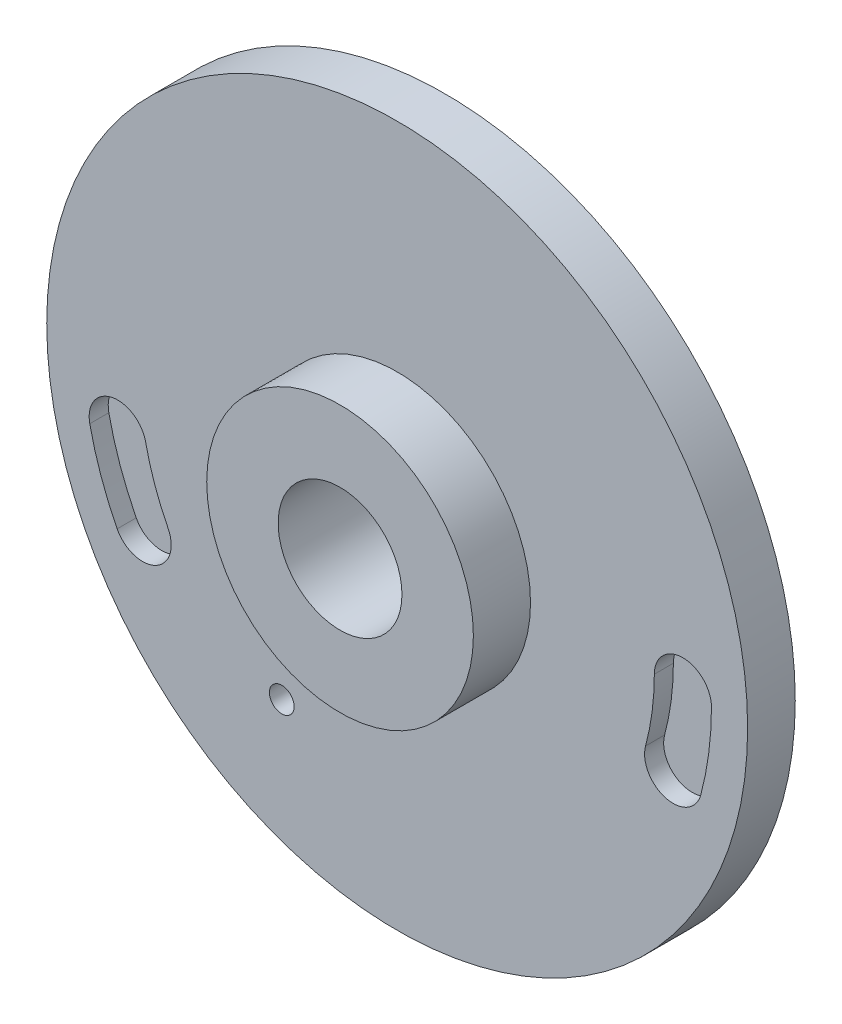
ISO-10303-21;
HEADER;
FILE_DESCRIPTION(('STEP AP214'),'2;1');
FILE_NAME('part.step','',(''),(''),'','','');
FILE_SCHEMA(('AUTOMOTIVE_DESIGN { 1 0 10303 214 1 1 1 1 }'));
ENDSEC;
DATA;
#1=APPLICATION_CONTEXT('core data for automotive mechanical design processes');
#2=APPLICATION_PROTOCOL_DEFINITION('international standard','automotive_design',2000,#1);
#3=PRODUCT_CONTEXT('',#1,'mechanical');
#4=PRODUCT('Part','Part','',(#3));
#5=PRODUCT_RELATED_PRODUCT_CATEGORY('part','',(#4));
#6=PRODUCT_DEFINITION_FORMATION('','',#4);
#7=PRODUCT_DEFINITION_CONTEXT('part definition',#1,'design');
#8=PRODUCT_DEFINITION('design','',#6,#7);
#9=PRODUCT_DEFINITION_SHAPE('','',#8);
#10=(LENGTH_UNIT() NAMED_UNIT(*) SI_UNIT(.MILLI.,.METRE.));
#11=(NAMED_UNIT(*) PLANE_ANGLE_UNIT() SI_UNIT($,.RADIAN.));
#12=(NAMED_UNIT(*) SI_UNIT($,.STERADIAN.) SOLID_ANGLE_UNIT());
#13=UNCERTAINTY_MEASURE_WITH_UNIT(LENGTH_MEASURE(1.E-05),#10,'distance_accuracy_value','');
#14=(GEOMETRIC_REPRESENTATION_CONTEXT(3) GLOBAL_UNCERTAINTY_ASSIGNED_CONTEXT((#13)) GLOBAL_UNIT_ASSIGNED_CONTEXT((#10,
#11,#12)) REPRESENTATION_CONTEXT('',''));
#15=CARTESIAN_POINT('',(0.,0.,0.));
#16=DIRECTION('',(0.,0.,1.));
#17=DIRECTION('',(1.,0.,0.));
#18=AXIS2_PLACEMENT_3D('',#15,#16,#17);
#19=CARTESIAN_POINT('',(0.,0.,5.));
#20=DIRECTION('',(0.,0.,1.));
#21=DIRECTION('',(1.,0.,0.));
#22=AXIS2_PLACEMENT_3D('',#19,#20,#21);
#23=PLANE('',#22);
#24=CARTESIAN_POINT('',(-12.1202405061581,-21.8654926784851,5.));
#25=DIRECTION('',(0.,0.,1.));
#26=DIRECTION('',(1.,0.,0.));
#27=AXIS2_PLACEMENT_3D('',#24,#25,#26);
#28=CIRCLE('',#27,1.3);
#29=CARTESIAN_POINT('',(-10.8202405061581,-21.8654926784851,5.));
#30=VERTEX_POINT('',#29);
#31=EDGE_CURVE('E322',#30,#30,#28,.T.);
#32=ORIENTED_EDGE('',*,*,#31,.F.);
#33=EDGE_LOOP('',(#32));
#34=FACE_BOUND('',#33,.T.);
#35=CARTESIAN_POINT('',(-26.7301957256509,-13.6197149921867,5.));
#36=DIRECTION('',(0.,0.,1.));
#37=DIRECTION('',(1.,0.,0.));
#38=AXIS2_PLACEMENT_3D('',#35,#36,#37);
#39=CIRCLE('',#38,3.);
#40=CARTESIAN_POINT('',(-29.403215298216,-14.9816864914054,5.));
#41=VERTEX_POINT('',#40);
#42=CARTESIAN_POINT('',(-24.0571761530858,-12.257743492968,5.));
#43=VERTEX_POINT('',#42);
#44=EDGE_CURVE('E89',#41,#43,#39,.T.);
#45=ORIENTED_EDGE('',*,*,#44,.F.);
#46=CARTESIAN_POINT('',(0.,0.,5.));
#47=DIRECTION('',(0.,0.,1.));
#48=DIRECTION('',(1.,0.,0.));
#49=AXIS2_PLACEMENT_3D('',#46,#47,#48);
#50=CIRCLE('',#49,33.);
#51=CARTESIAN_POINT('',(-32.2788708242155,-6.86108579698641,5.));
#52=VERTEX_POINT('',#51);
#53=EDGE_CURVE('E191',#52,#41,#50,.T.);
#54=ORIENTED_EDGE('',*,*,#53,.F.);
#55=CARTESIAN_POINT('',(-29.3444280220141,-6.2373507245331,5.));
#56=DIRECTION('',(0.,0.,1.));
#57=DIRECTION('',(1.,0.,0.));
#58=AXIS2_PLACEMENT_3D('',#55,#56,#57);
#59=CIRCLE('',#58,3.);
#60=CARTESIAN_POINT('',(-26.4099852198127,-5.61361565207979,5.));
#61=VERTEX_POINT('',#60);
#62=EDGE_CURVE('E210',#61,#52,#59,.T.);
#63=ORIENTED_EDGE('',*,*,#62,.F.);
#64=CARTESIAN_POINT('',(0.,0.,5.));
#65=DIRECTION('',(0.,0.,-1.));
#66=DIRECTION('',(1.,0.,0.));
#67=AXIS2_PLACEMENT_3D('',#64,#65,#66);
#68=CIRCLE('',#67,27.);
#69=EDGE_CURVE('E206',#43,#61,#68,.T.);
#70=ORIENTED_EDGE('',*,*,#69,.F.);
#71=EDGE_LOOP('',(#45,#54,#63,#70));
#72=FACE_BOUND('',#71,.T.);
#73=CARTESIAN_POINT('',(0.,0.,5.));
#74=DIRECTION('',(0.,0.,1.));
#75=DIRECTION('',(1.,0.,0.));
#76=AXIS2_PLACEMENT_3D('',#73,#74,#75);
#77=CIRCLE('',#76,14.);
#78=CARTESIAN_POINT('',(14.,0.,5.));
#79=VERTEX_POINT('',#78);
#80=EDGE_CURVE('E13',#79,#79,#77,.T.);
#81=ORIENTED_EDGE('',*,*,#80,.F.);
#82=EDGE_LOOP('',(#81));
#83=FACE_BOUND('',#82,.T.);
#84=CARTESIAN_POINT('',(0.,0.,5.));
#85=DIRECTION('',(0.,0.,1.));
#86=DIRECTION('',(1.,0.,0.));
#87=AXIS2_PLACEMENT_3D('',#84,#85,#86);
#88=CIRCLE('',#87,36.8);
#89=CARTESIAN_POINT('',(36.8,0.,5.));
#90=VERTEX_POINT('',#89);
#91=EDGE_CURVE('E73',#90,#90,#88,.T.);
#92=ORIENTED_EDGE('',*,*,#91,.T.);
#93=EDGE_LOOP('',(#92));
#94=FACE_BOUND('',#93,.T.);
#95=CARTESIAN_POINT('',(30.,0.,5.));
#96=DIRECTION('',(0.,0.,1.));
#97=DIRECTION('',(1.,0.,0.));
#98=AXIS2_PLACEMENT_3D('',#95,#96,#97);
#99=CIRCLE('',#98,3.);
#100=CARTESIAN_POINT('',(33.,0.,5.));
#101=VERTEX_POINT('',#100);
#102=CARTESIAN_POINT('',(27.,0.,5.));
#103=VERTEX_POINT('',#102);
#104=EDGE_CURVE('E81',#101,#103,#99,.T.);
#105=ORIENTED_EDGE('',*,*,#104,.F.);
#106=CARTESIAN_POINT('',(0.,0.,5.));
#107=DIRECTION('',(0.,0.,1.));
#108=DIRECTION('',(1.,0.,0.));
#109=AXIS2_PLACEMENT_3D('',#106,#107,#108);
#110=CIRCLE('',#109,33.);
#111=CARTESIAN_POINT('',(31.8755522675393,-8.5410284883831,5.));
#112=VERTEX_POINT('',#111);
#113=EDGE_CURVE('E154',#112,#101,#110,.T.);
#114=ORIENTED_EDGE('',*,*,#113,.F.);
#115=CARTESIAN_POINT('',(28.9777747886721,-7.76457135307553,5.));
#116=DIRECTION('',(0.,0.,1.));
#117=DIRECTION('',(1.,0.,0.));
#118=AXIS2_PLACEMENT_3D('',#115,#116,#117);
#119=CIRCLE('',#118,3.);
#120=CARTESIAN_POINT('',(26.0799973098049,-6.98811421776798,5.));
#121=VERTEX_POINT('',#120);
#122=EDGE_CURVE('E160',#121,#112,#119,.T.);
#123=ORIENTED_EDGE('',*,*,#122,.F.);
#124=CARTESIAN_POINT('',(0.,0.,5.));
#125=DIRECTION('',(0.,0.,-1.));
#126=DIRECTION('',(1.,0.,0.));
#127=AXIS2_PLACEMENT_3D('',#124,#125,#126);
#128=CIRCLE('',#127,27.);
#129=EDGE_CURVE('E172',#103,#121,#128,.T.);
#130=ORIENTED_EDGE('',*,*,#129,.F.);
#131=EDGE_LOOP('',(#105,#114,#123,#130));
#132=FACE_BOUND('',#131,.T.);
#133=ADVANCED_FACE('F63',(#34,#72,#83,#94,#132),#23,.T.);
#134=CARTESIAN_POINT('',(0.,0.,5.));
#135=DIRECTION('',(0.,0.,-1.));
#136=DIRECTION('',(-1.,0.,0.));
#137=AXIS2_PLACEMENT_3D('',#134,#135,#136);
#138=CYLINDRICAL_SURFACE('',#137,36.8);
#139=ORIENTED_EDGE('',*,*,#91,.F.);
#140=EDGE_LOOP('',(#139));
#141=FACE_BOUND('',#140,.T.);
#142=CARTESIAN_POINT('',(0.,0.,0.));
#143=DIRECTION('',(0.,0.,1.));
#144=DIRECTION('',(1.,0.,0.));
#145=AXIS2_PLACEMENT_3D('',#142,#143,#144);
#146=CIRCLE('',#145,36.8);
#147=CARTESIAN_POINT('',(36.8,0.,0.));
#148=VERTEX_POINT('',#147);
#149=EDGE_CURVE('E67',#148,#148,#146,.T.);
#150=ORIENTED_EDGE('',*,*,#149,.T.);
#151=EDGE_LOOP('',(#150));
#152=FACE_BOUND('',#151,.T.);
#153=ADVANCED_FACE('F65',(#141,#152),#138,.T.);
#154=CARTESIAN_POINT('',(0.,0.,0.));
#155=DIRECTION('',(0.,0.,1.));
#156=DIRECTION('',(1.,0.,0.));
#157=AXIS2_PLACEMENT_3D('',#154,#155,#156);
#158=PLANE('',#157);
#159=CARTESIAN_POINT('',(-12.1202405061581,-21.8654926784851,0.));
#160=DIRECTION('',(0.,0.,1.));
#161=DIRECTION('',(1.,0.,0.));
#162=AXIS2_PLACEMENT_3D('',#159,#160,#161);
#163=CIRCLE('',#162,1.3);
#164=CARTESIAN_POINT('',(-10.8202405061581,-21.8654926784851,0.));
#165=VERTEX_POINT('',#164);
#166=EDGE_CURVE('E163',#165,#165,#163,.T.);
#167=ORIENTED_EDGE('',*,*,#166,.T.);
#168=EDGE_LOOP('',(#167));
#169=FACE_BOUND('',#168,.T.);
#170=CARTESIAN_POINT('',(0.,0.,0.));
#171=DIRECTION('',(0.,0.,1.));
#172=DIRECTION('',(1.,0.,0.));
#173=AXIS2_PLACEMENT_3D('',#170,#171,#172);
#174=CIRCLE('',#173,6.5);
#175=CARTESIAN_POINT('',(6.5,0.,0.));
#176=VERTEX_POINT('',#175);
#177=EDGE_CURVE('E229',#176,#176,#174,.T.);
#178=ORIENTED_EDGE('',*,*,#177,.T.);
#179=EDGE_LOOP('',(#178));
#180=FACE_BOUND('',#179,.T.);
#181=ORIENTED_EDGE('',*,*,#149,.F.);
#182=EDGE_LOOP('',(#181));
#183=FACE_BOUND('',#182,.T.);
#184=ADVANCED_FACE('F252',(#169,#180,#183),#158,.F.);
#185=CARTESIAN_POINT('',(0.,0.,11.));
#186=DIRECTION('',(0.,0.,-1.));
#187=DIRECTION('',(-1.,0.,0.));
#188=AXIS2_PLACEMENT_3D('',#185,#186,#187);
#189=CYLINDRICAL_SURFACE('',#188,14.);
#190=CARTESIAN_POINT('',(0.,0.,11.));
#191=DIRECTION('',(0.,0.,1.));
#192=DIRECTION('',(1.,0.,0.));
#193=AXIS2_PLACEMENT_3D('',#190,#191,#192);
#194=CIRCLE('',#193,14.);
#195=CARTESIAN_POINT('',(14.,0.,11.));
#196=VERTEX_POINT('',#195);
#197=EDGE_CURVE('E233',#196,#196,#194,.T.);
#198=ORIENTED_EDGE('',*,*,#197,.F.);
#199=EDGE_LOOP('',(#198));
#200=FACE_BOUND('',#199,.T.);
#201=ORIENTED_EDGE('',*,*,#80,.T.);
#202=EDGE_LOOP('',(#201));
#203=FACE_BOUND('',#202,.T.);
#204=ADVANCED_FACE('F254',(#200,#203),#189,.T.);
#205=CARTESIAN_POINT('',(0.,0.,11.));
#206=DIRECTION('',(0.,0.,1.));
#207=DIRECTION('',(1.,0.,0.));
#208=AXIS2_PLACEMENT_3D('',#205,#206,#207);
#209=PLANE('',#208);
#210=CARTESIAN_POINT('',(0.,0.,11.));
#211=DIRECTION('',(0.,0.,1.));
#212=DIRECTION('',(1.,0.,0.));
#213=AXIS2_PLACEMENT_3D('',#210,#211,#212);
#214=CIRCLE('',#213,6.5);
#215=CARTESIAN_POINT('',(6.5,0.,11.));
#216=VERTEX_POINT('',#215);
#217=EDGE_CURVE('E220',#216,#216,#214,.T.);
#218=ORIENTED_EDGE('',*,*,#217,.F.);
#219=EDGE_LOOP('',(#218));
#220=FACE_BOUND('',#219,.T.);
#221=ORIENTED_EDGE('',*,*,#197,.T.);
#222=EDGE_LOOP('',(#221));
#223=FACE_BOUND('',#222,.T.);
#224=ADVANCED_FACE('F260',(#220,#223),#209,.T.);
#225=CARTESIAN_POINT('',(0.,0.,0.));
#226=DIRECTION('',(0.,0.,1.));
#227=DIRECTION('',(1.,0.,0.));
#228=AXIS2_PLACEMENT_3D('',#225,#226,#227);
#229=CYLINDRICAL_SURFACE('',#228,6.5);
#230=ORIENTED_EDGE('',*,*,#177,.F.);
#231=EDGE_LOOP('',(#230));
#232=FACE_BOUND('',#231,.T.);
#233=ORIENTED_EDGE('',*,*,#217,.T.);
#234=EDGE_LOOP('',(#233));
#235=FACE_BOUND('',#234,.T.);
#236=ADVANCED_FACE('F276',(#232,#235),#229,.F.);
#237=CARTESIAN_POINT('',(-26.7301957256509,-13.6197149921867,3.));
#238=DIRECTION('',(0.,0.,1.));
#239=DIRECTION('',(1.,0.,0.));
#240=AXIS2_PLACEMENT_3D('',#237,#238,#239);
#241=CYLINDRICAL_SURFACE('',#240,3.);
#242=ORIENTED_EDGE('',*,*,#44,.T.);
#243=DIRECTION('',(0.,0.,1.));
#244=VECTOR('',#243,1.);
#245=CARTESIAN_POINT('',(-24.0571761530858,-12.257743492968,3.));
#246=LINE('',#245,#244);
#247=CARTESIAN_POINT('',(-24.0571761530858,-12.257743492968,3.));
#248=VERTEX_POINT('',#247);
#249=EDGE_CURVE('E203',#248,#43,#246,.T.);
#250=ORIENTED_EDGE('',*,*,#249,.F.);
#251=CARTESIAN_POINT('',(-26.7301957256509,-13.6197149921867,3.));
#252=DIRECTION('',(0.,0.,1.));
#253=DIRECTION('',(1.,0.,0.));
#254=AXIS2_PLACEMENT_3D('',#251,#252,#253);
#255=CIRCLE('',#254,3.);
#256=CARTESIAN_POINT('',(-29.403215298216,-14.9816864914054,3.));
#257=VERTEX_POINT('',#256);
#258=EDGE_CURVE('E186',#257,#248,#255,.T.);
#259=ORIENTED_EDGE('',*,*,#258,.F.);
#260=DIRECTION('',(0.,0.,1.));
#261=VECTOR('',#260,1.);
#262=CARTESIAN_POINT('',(-29.403215298216,-14.9816864914054,3.));
#263=LINE('',#262,#261);
#264=EDGE_CURVE('E217',#257,#41,#263,.T.);
#265=ORIENTED_EDGE('',*,*,#264,.T.);
#266=EDGE_LOOP('',(#242,#250,#259,#265));
#267=FACE_BOUND('',#266,.T.);
#268=ADVANCED_FACE('F280',(#267),#241,.F.);
#269=CARTESIAN_POINT('',(0.,0.,3.));
#270=DIRECTION('',(0.,0.,1.));
#271=DIRECTION('',(1.,0.,0.));
#272=AXIS2_PLACEMENT_3D('',#269,#270,#271);
#273=CYLINDRICAL_SURFACE('',#272,33.);
#274=ORIENTED_EDGE('',*,*,#53,.T.);
#275=ORIENTED_EDGE('',*,*,#264,.F.);
#276=CARTESIAN_POINT('',(0.,0.,3.));
#277=DIRECTION('',(0.,0.,1.));
#278=DIRECTION('',(1.,0.,0.));
#279=AXIS2_PLACEMENT_3D('',#276,#277,#278);
#280=CIRCLE('',#279,33.);
#281=CARTESIAN_POINT('',(-32.2788708242155,-6.86108579698641,3.));
#282=VERTEX_POINT('',#281);
#283=EDGE_CURVE('E199',#282,#257,#280,.T.);
#284=ORIENTED_EDGE('',*,*,#283,.F.);
#285=DIRECTION('',(0.,0.,1.));
#286=VECTOR('',#285,1.);
#287=CARTESIAN_POINT('',(-32.2788708242155,-6.86108579698641,3.));
#288=LINE('',#287,#286);
#289=EDGE_CURVE('E221',#282,#52,#288,.T.);
#290=ORIENTED_EDGE('',*,*,#289,.T.);
#291=EDGE_LOOP('',(#274,#275,#284,#290));
#292=FACE_BOUND('',#291,.T.);
#293=ADVANCED_FACE('F284',(#292),#273,.F.);
#294=CARTESIAN_POINT('',(-29.3444280220141,-6.2373507245331,3.));
#295=DIRECTION('',(0.,0.,1.));
#296=DIRECTION('',(1.,0.,0.));
#297=AXIS2_PLACEMENT_3D('',#294,#295,#296);
#298=CYLINDRICAL_SURFACE('',#297,3.);
#299=ORIENTED_EDGE('',*,*,#62,.T.);
#300=ORIENTED_EDGE('',*,*,#289,.F.);
#301=CARTESIAN_POINT('',(-29.3444280220141,-6.2373507245331,3.));
#302=DIRECTION('',(0.,0.,1.));
#303=DIRECTION('',(1.,0.,0.));
#304=AXIS2_PLACEMENT_3D('',#301,#302,#303);
#305=CIRCLE('',#304,3.);
#306=CARTESIAN_POINT('',(-26.4099852198127,-5.61361565207979,3.));
#307=VERTEX_POINT('',#306);
#308=EDGE_CURVE('E195',#307,#282,#305,.T.);
#309=ORIENTED_EDGE('',*,*,#308,.F.);
#310=DIRECTION('',(0.,0.,1.));
#311=VECTOR('',#310,1.);
#312=CARTESIAN_POINT('',(-26.4099852198127,-5.61361565207979,3.));
#313=LINE('',#312,#311);
#314=EDGE_CURVE('E224',#307,#61,#313,.T.);
#315=ORIENTED_EDGE('',*,*,#314,.T.);
#316=EDGE_LOOP('',(#299,#300,#309,#315));
#317=FACE_BOUND('',#316,.T.);
#318=ADVANCED_FACE('F289',(#317),#298,.F.);
#319=CARTESIAN_POINT('',(0.,0.,3.));
#320=DIRECTION('',(0.,0.,1.));
#321=DIRECTION('',(1.,0.,0.));
#322=AXIS2_PLACEMENT_3D('',#319,#320,#321);
#323=CYLINDRICAL_SURFACE('',#322,27.);
#324=ORIENTED_EDGE('',*,*,#69,.T.);
#325=ORIENTED_EDGE('',*,*,#314,.F.);
#326=CARTESIAN_POINT('',(0.,0.,3.));
#327=DIRECTION('',(0.,0.,-1.));
#328=DIRECTION('',(1.,0.,0.));
#329=AXIS2_PLACEMENT_3D('',#326,#327,#328);
#330=CIRCLE('',#329,27.);
#331=EDGE_CURVE('E190',#248,#307,#330,.T.);
#332=ORIENTED_EDGE('',*,*,#331,.F.);
#333=ORIENTED_EDGE('',*,*,#249,.T.);
#334=EDGE_LOOP('',(#324,#325,#332,#333));
#335=FACE_BOUND('',#334,.T.);
#336=ADVANCED_FACE('F285',(#335),#323,.T.);
#337=CARTESIAN_POINT('',(-13.3650978628254,-6.80985749609336,3.));
#338=DIRECTION('',(0.,0.,1.));
#339=DIRECTION('',(1.,0.,0.));
#340=AXIS2_PLACEMENT_3D('',#337,#338,#339);
#341=PLANE('',#340);
#342=ORIENTED_EDGE('',*,*,#258,.T.);
#343=ORIENTED_EDGE('',*,*,#331,.T.);
#344=ORIENTED_EDGE('',*,*,#308,.T.);
#345=ORIENTED_EDGE('',*,*,#283,.T.);
#346=EDGE_LOOP('',(#342,#343,#344,#345));
#347=FACE_BOUND('',#346,.T.);
#348=ADVANCED_FACE('F288',(#347),#341,.T.);
#349=CARTESIAN_POINT('',(30.,0.,3.));
#350=DIRECTION('',(0.,0.,1.));
#351=DIRECTION('',(1.,0.,0.));
#352=AXIS2_PLACEMENT_3D('',#349,#350,#351);
#353=CYLINDRICAL_SURFACE('',#352,3.);
#354=ORIENTED_EDGE('',*,*,#104,.T.);
#355=DIRECTION('',(0.,0.,1.));
#356=VECTOR('',#355,1.);
#357=CARTESIAN_POINT('',(27.,0.,3.));
#358=LINE('',#357,#356);
#359=CARTESIAN_POINT('',(27.,0.,3.));
#360=VERTEX_POINT('',#359);
#361=EDGE_CURVE('E129',#360,#103,#358,.T.);
#362=ORIENTED_EDGE('',*,*,#361,.F.);
#363=CARTESIAN_POINT('',(30.,0.,3.));
#364=DIRECTION('',(0.,0.,1.));
#365=DIRECTION('',(1.,0.,0.));
#366=AXIS2_PLACEMENT_3D('',#363,#364,#365);
#367=CIRCLE('',#366,3.);
#368=CARTESIAN_POINT('',(33.,0.,3.));
#369=VERTEX_POINT('',#368);
#370=EDGE_CURVE('E133',#369,#360,#367,.T.);
#371=ORIENTED_EDGE('',*,*,#370,.F.);
#372=DIRECTION('',(0.,0.,1.));
#373=VECTOR('',#372,1.);
#374=CARTESIAN_POINT('',(33.,0.,3.));
#375=LINE('',#374,#373);
#376=EDGE_CURVE('E178',#369,#101,#375,.T.);
#377=ORIENTED_EDGE('',*,*,#376,.T.);
#378=EDGE_LOOP('',(#354,#362,#371,#377));
#379=FACE_BOUND('',#378,.T.);
#380=ADVANCED_FACE('F131',(#379),#353,.F.);
#381=CARTESIAN_POINT('',(0.,0.,3.));
#382=DIRECTION('',(0.,0.,1.));
#383=DIRECTION('',(1.,0.,0.));
#384=AXIS2_PLACEMENT_3D('',#381,#382,#383);
#385=CYLINDRICAL_SURFACE('',#384,33.);
#386=ORIENTED_EDGE('',*,*,#113,.T.);
#387=ORIENTED_EDGE('',*,*,#376,.F.);
#388=CARTESIAN_POINT('',(0.,0.,3.));
#389=DIRECTION('',(0.,0.,1.));
#390=DIRECTION('',(1.,0.,0.));
#391=AXIS2_PLACEMENT_3D('',#388,#389,#390);
#392=CIRCLE('',#391,33.);
#393=CARTESIAN_POINT('',(31.8755522675393,-8.5410284883831,3.));
#394=VERTEX_POINT('',#393);
#395=EDGE_CURVE('E140',#394,#369,#392,.T.);
#396=ORIENTED_EDGE('',*,*,#395,.F.);
#397=DIRECTION('',(0.,0.,1.));
#398=VECTOR('',#397,1.);
#399=CARTESIAN_POINT('',(31.8755522675393,-8.5410284883831,3.));
#400=LINE('',#399,#398);
#401=EDGE_CURVE('E181',#394,#112,#400,.T.);
#402=ORIENTED_EDGE('',*,*,#401,.T.);
#403=EDGE_LOOP('',(#386,#387,#396,#402));
#404=FACE_BOUND('',#403,.T.);
#405=ADVANCED_FACE('F302',(#404),#385,.F.);
#406=CARTESIAN_POINT('',(28.9777747886721,-7.76457135307553,3.));
#407=DIRECTION('',(0.,0.,1.));
#408=DIRECTION('',(1.,0.,0.));
#409=AXIS2_PLACEMENT_3D('',#406,#407,#408);
#410=CYLINDRICAL_SURFACE('',#409,3.);
#411=ORIENTED_EDGE('',*,*,#122,.T.);
#412=ORIENTED_EDGE('',*,*,#401,.F.);
#413=CARTESIAN_POINT('',(28.9777747886721,-7.76457135307553,3.));
#414=DIRECTION('',(0.,0.,1.));
#415=DIRECTION('',(1.,0.,0.));
#416=AXIS2_PLACEMENT_3D('',#413,#414,#415);
#417=CIRCLE('',#416,3.);
#418=CARTESIAN_POINT('',(26.0799973098049,-6.98811421776798,3.));
#419=VERTEX_POINT('',#418);
#420=EDGE_CURVE('E149',#419,#394,#417,.T.);
#421=ORIENTED_EDGE('',*,*,#420,.F.);
#422=DIRECTION('',(0.,0.,1.));
#423=VECTOR('',#422,1.);
#424=CARTESIAN_POINT('',(26.0799973098049,-6.98811421776798,3.));
#425=LINE('',#424,#423);
#426=EDGE_CURVE('E139',#419,#121,#425,.T.);
#427=ORIENTED_EDGE('',*,*,#426,.T.);
#428=EDGE_LOOP('',(#411,#412,#421,#427));
#429=FACE_BOUND('',#428,.T.);
#430=ADVANCED_FACE('F305',(#429),#410,.F.);
#431=CARTESIAN_POINT('',(0.,0.,3.));
#432=DIRECTION('',(0.,0.,1.));
#433=DIRECTION('',(1.,0.,0.));
#434=AXIS2_PLACEMENT_3D('',#431,#432,#433);
#435=CYLINDRICAL_SURFACE('',#434,27.);
#436=ORIENTED_EDGE('',*,*,#129,.T.);
#437=ORIENTED_EDGE('',*,*,#426,.F.);
#438=CARTESIAN_POINT('',(0.,0.,3.));
#439=DIRECTION('',(0.,0.,-1.));
#440=DIRECTION('',(1.,0.,0.));
#441=AXIS2_PLACEMENT_3D('',#438,#439,#440);
#442=CIRCLE('',#441,27.);
#443=EDGE_CURVE('E143',#360,#419,#442,.T.);
#444=ORIENTED_EDGE('',*,*,#443,.F.);
#445=ORIENTED_EDGE('',*,*,#361,.T.);
#446=EDGE_LOOP('',(#436,#437,#444,#445));
#447=FACE_BOUND('',#446,.T.);
#448=ADVANCED_FACE('F144',(#447),#435,.T.);
#449=CARTESIAN_POINT('',(15.,0.,3.));
#450=DIRECTION('',(0.,0.,1.));
#451=DIRECTION('',(1.,0.,0.));
#452=AXIS2_PLACEMENT_3D('',#449,#450,#451);
#453=PLANE('',#452);
#454=ORIENTED_EDGE('',*,*,#370,.T.);
#455=ORIENTED_EDGE('',*,*,#443,.T.);
#456=ORIENTED_EDGE('',*,*,#420,.T.);
#457=ORIENTED_EDGE('',*,*,#395,.T.);
#458=EDGE_LOOP('',(#454,#455,#456,#457));
#459=FACE_BOUND('',#458,.T.);
#460=ADVANCED_FACE('F151',(#459),#453,.T.);
#461=CARTESIAN_POINT('',(-12.1202405061581,-21.8654926784851,5.));
#462=DIRECTION('',(0.,0.,1.));
#463=DIRECTION('',(1.,0.,0.));
#464=AXIS2_PLACEMENT_3D('',#461,#462,#463);
#465=CYLINDRICAL_SURFACE('',#464,1.3);
#466=ORIENTED_EDGE('',*,*,#166,.F.);
#467=EDGE_LOOP('',(#466));
#468=FACE_BOUND('',#467,.T.);
#469=ORIENTED_EDGE('',*,*,#31,.T.);
#470=EDGE_LOOP('',(#469));
#471=FACE_BOUND('',#470,.T.);
#472=ADVANCED_FACE('F314',(#468,#471),#465,.F.);
#473=CLOSED_SHELL('',(#133,#153,#184,#204,#224,#236,#268,#293,#318,#336,#348,#380,#405,#430,
#448,#460,#472));
#474=MANIFOLD_SOLID_BREP('B2',#473);
#475=ADVANCED_BREP_SHAPE_REPRESENTATION('',(#18,#474),#14);
#476=SHAPE_DEFINITION_REPRESENTATION(#9,#475);
ENDSEC;
END-ISO-10303-21;
